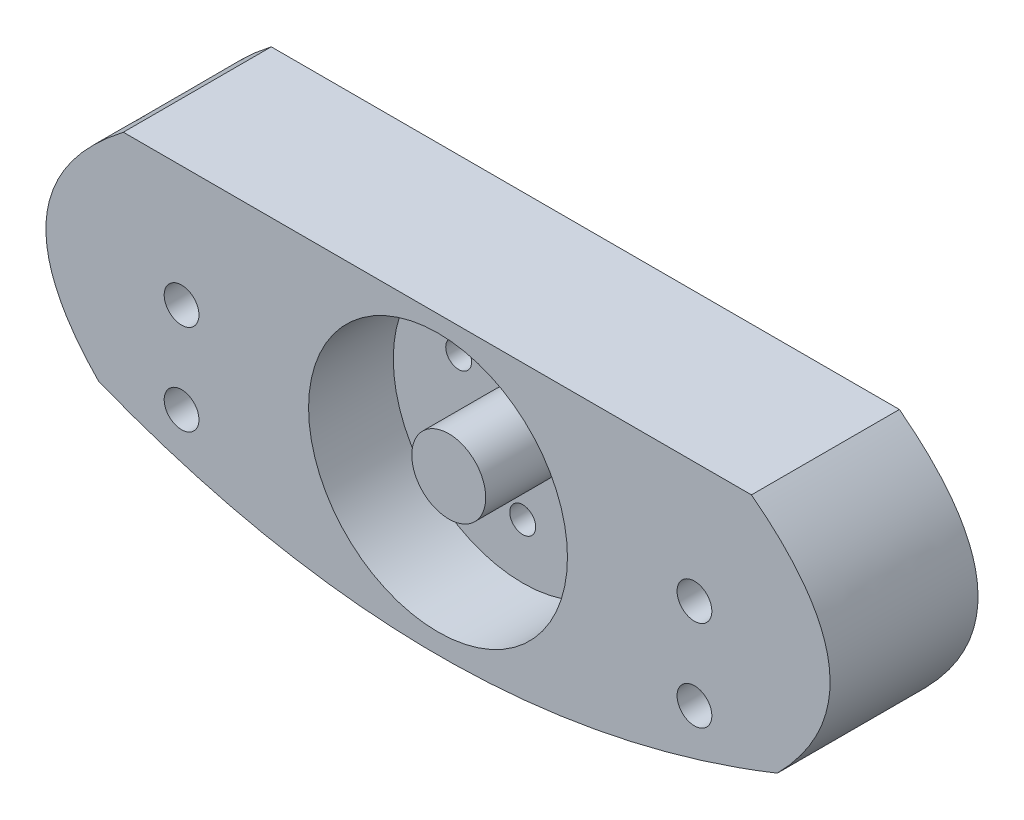
ISO-10303-21;
HEADER;
FILE_DESCRIPTION(('STEP AP214'),'2;1');
FILE_NAME('part.step','',(''),(''),'','','');
FILE_SCHEMA(('AUTOMOTIVE_DESIGN { 1 0 10303 214 1 1 1 1 }'));
ENDSEC;
DATA;
#1=APPLICATION_CONTEXT('core data for automotive mechanical design processes');
#2=APPLICATION_PROTOCOL_DEFINITION('international standard','automotive_design',2000,#1);
#3=PRODUCT_CONTEXT('',#1,'mechanical');
#4=PRODUCT('Part','Part','',(#3));
#5=PRODUCT_RELATED_PRODUCT_CATEGORY('part','',(#4));
#6=PRODUCT_DEFINITION_FORMATION('','',#4);
#7=PRODUCT_DEFINITION_CONTEXT('part definition',#1,'design');
#8=PRODUCT_DEFINITION('design','',#6,#7);
#9=PRODUCT_DEFINITION_SHAPE('','',#8);
#10=(LENGTH_UNIT() NAMED_UNIT(*) SI_UNIT(.MILLI.,.METRE.));
#11=(NAMED_UNIT(*) PLANE_ANGLE_UNIT() SI_UNIT($,.RADIAN.));
#12=(NAMED_UNIT(*) SI_UNIT($,.STERADIAN.) SOLID_ANGLE_UNIT());
#13=UNCERTAINTY_MEASURE_WITH_UNIT(LENGTH_MEASURE(1.E-05),#10,'distance_accuracy_value','');
#14=(GEOMETRIC_REPRESENTATION_CONTEXT(3) GLOBAL_UNCERTAINTY_ASSIGNED_CONTEXT((#13)) GLOBAL_UNIT_ASSIGNED_CONTEXT((#10,
#11,#12)) REPRESENTATION_CONTEXT('',''));
#15=CARTESIAN_POINT('',(0.,0.,0.));
#16=DIRECTION('',(0.,0.,1.));
#17=DIRECTION('',(1.,0.,0.));
#18=AXIS2_PLACEMENT_3D('',#15,#16,#17);
#19=CARTESIAN_POINT('',(-26324.5669752952,999737.504268862,20.));
#20=CARTESIAN_POINT('',(11140.8528513191,-999969.224310154,20.));
#21=CARTESIAN_POINT('',(4048.40687662535,1000075.86398588,20.));
#22=B_SPLINE_CURVE_WITH_KNOTS('',2,(#19,#20,#21),.UNSPECIFIED.,.F.,.F.,(3,3),(0.,1.),.UNSPECIFIED.);
#23=DIRECTION('',(0.,0.,-1.));
#24=VECTOR('',#23,1.);
#25=SURFACE_OF_LINEAR_EXTRUSION('',#22,#24);
#26=CARTESIAN_POINT('',(-26324.5669752952,999737.504268862,0.));
#27=CARTESIAN_POINT('',(11140.8528513191,-999969.224310154,0.));
#28=CARTESIAN_POINT('',(4048.40687662535,1000075.86398588,0.));
#29=B_SPLINE_CURVE_WITH_KNOTS('',2,(#26,#27,#28),.UNSPECIFIED.,.F.,.F.,(3,3),(0.,1.),.UNSPECIFIED.);
#30=CARTESIAN_POINT('',(-45.8736983758243,-22.1554979709055,0.));
#31=VERTEX_POINT('',#30);
#32=CARTESIAN_POINT('',(45.8736984182559,-22.1554979278173,0.));
#33=VERTEX_POINT('',#32);
#34=EDGE_CURVE('E108',#31,#33,#29,.T.);
#35=ORIENTED_EDGE('',*,*,#34,.T.);
#36=DIRECTION('',(0.,0.,-1.));
#37=VECTOR('',#36,1.);
#38=CARTESIAN_POINT('',(45.8736984182559,-22.1554979278173,20.));
#39=LINE('',#38,#37);
#40=CARTESIAN_POINT('',(45.8736984182559,-22.1554979278173,20.));
#41=VERTEX_POINT('',#40);
#42=EDGE_CURVE('E11',#41,#33,#39,.T.);
#43=ORIENTED_EDGE('',*,*,#42,.F.);
#44=CARTESIAN_POINT('',(-45.8736983758243,-22.1554979709055,20.));
#45=VERTEX_POINT('',#44);
#46=EDGE_CURVE('E90',#45,#41,#22,.T.);
#47=ORIENTED_EDGE('',*,*,#46,.F.);
#48=DIRECTION('',(0.,0.,-1.));
#49=VECTOR('',#48,1.);
#50=CARTESIAN_POINT('',(-45.8736983758243,-22.1554979709055,20.));
#51=LINE('',#50,#49);
#52=EDGE_CURVE('E99',#45,#31,#51,.T.);
#53=ORIENTED_EDGE('',*,*,#52,.T.);
#54=EDGE_LOOP('',(#35,#43,#47,#53));
#55=FACE_BOUND('',#54,.T.);
#56=ADVANCED_FACE('F36',(#55),#25,.F.);
#57=CARTESIAN_POINT('',(-998869.892599196,-46700.884225398,20.));
#58=CARTESIAN_POINT('',(999192.30166922,41473.3119298266,20.));
#59=CARTESIAN_POINT('',(-999302.733099754,-36275.1095081386,20.));
#60=B_SPLINE_CURVE_WITH_KNOTS('',2,(#57,#58,#59),.UNSPECIFIED.,.F.,.F.,(3,3),(0.,1.),.UNSPECIFIED.);
#61=DIRECTION('',(0.,0.,-1.));
#62=VECTOR('',#61,1.);
#63=SURFACE_OF_LINEAR_EXTRUSION('',#60,#62);
#64=CARTESIAN_POINT('',(-998869.892599196,-46700.884225398,0.));
#65=CARTESIAN_POINT('',(999192.30166922,41473.3119298266,0.));
#66=CARTESIAN_POINT('',(-999302.733099754,-36275.1095081386,0.));
#67=B_SPLINE_CURVE_WITH_KNOTS('',2,(#64,#65,#66),.UNSPECIFIED.,.F.,.F.,(3,3),(0.,1.),.UNSPECIFIED.);
#68=CARTESIAN_POINT('',(42.3767761233695,8.68321874866895,0.));
#69=VERTEX_POINT('',#68);
#70=EDGE_CURVE('E94',#33,#69,#67,.T.);
#71=ORIENTED_EDGE('',*,*,#70,.T.);
#72=DIRECTION('',(0.,0.,-1.));
#73=VECTOR('',#72,1.);
#74=CARTESIAN_POINT('',(42.3767761233695,8.68321874866895,20.));
#75=LINE('',#74,#73);
#76=CARTESIAN_POINT('',(42.3767761233695,8.68321874866895,20.));
#77=VERTEX_POINT('',#76);
#78=EDGE_CURVE('E46',#77,#69,#75,.T.);
#79=ORIENTED_EDGE('',*,*,#78,.F.);
#80=EDGE_CURVE('E85',#41,#77,#60,.T.);
#81=ORIENTED_EDGE('',*,*,#80,.F.);
#82=ORIENTED_EDGE('',*,*,#42,.T.);
#83=EDGE_LOOP('',(#71,#79,#81,#82));
#84=FACE_BOUND('',#83,.T.);
#85=ADVANCED_FACE('F93',(#84),#63,.F.);
#86=CARTESIAN_POINT('',(42.3767761245835,8.68321874768441,20.));
#87=DIRECTION('',(1.15423428498959E-11,-1.,0.));
#88=DIRECTION('',(1.,1.15423428498959E-11,0.));
#89=AXIS2_PLACEMENT_3D('',#86,#87,#88);
#90=PLANE('',#89);
#91=DIRECTION('',(-1.,-1.15423428498959E-11,0.));
#92=VECTOR('',#91,1.);
#93=CARTESIAN_POINT('',(42.3767761245835,8.68321874768441,0.));
#94=LINE('',#93,#92);
#95=CARTESIAN_POINT('',(-42.5400898319191,8.68321874670427,0.));
#96=VERTEX_POINT('',#95);
#97=EDGE_CURVE('E72',#69,#96,#94,.T.);
#98=ORIENTED_EDGE('',*,*,#97,.T.);
#99=DIRECTION('',(0.,0.,-1.));
#100=VECTOR('',#99,1.);
#101=CARTESIAN_POINT('',(-42.5400898319191,8.68321874670427,20.));
#102=LINE('',#101,#100);
#103=CARTESIAN_POINT('',(-42.5400898319191,8.68321874670427,20.));
#104=VERTEX_POINT('',#103);
#105=EDGE_CURVE('E95',#104,#96,#102,.T.);
#106=ORIENTED_EDGE('',*,*,#105,.F.);
#107=DIRECTION('',(-1.,-1.15423428498959E-11,0.));
#108=VECTOR('',#107,1.);
#109=CARTESIAN_POINT('',(42.3767761245835,8.68321874768441,20.));
#110=LINE('',#109,#108);
#111=EDGE_CURVE('E88',#77,#104,#110,.T.);
#112=ORIENTED_EDGE('',*,*,#111,.F.);
#113=ORIENTED_EDGE('',*,*,#78,.T.);
#114=EDGE_LOOP('',(#98,#106,#112,#113));
#115=FACE_BOUND('',#114,.T.);
#116=ADVANCED_FACE('F97',(#115),#90,.F.);
#117=CARTESIAN_POINT('',(999423.299806603,-32787.8694532893,20.));
#118=CARTESIAN_POINT('',(-999330.20137227,38006.7010376896,20.));
#119=CARTESIAN_POINT('',(999025.115011576,-43254.9699162479,20.));
#120=B_SPLINE_CURVE_WITH_KNOTS('',2,(#117,#118,#119),.UNSPECIFIED.,.F.,.F.,(3,3),(0.,1.),.UNSPECIFIED.);
#121=DIRECTION('',(0.,0.,-1.));
#122=VECTOR('',#121,1.);
#123=SURFACE_OF_LINEAR_EXTRUSION('',#120,#122);
#124=CARTESIAN_POINT('',(999423.299806603,-32787.8694532893,0.));
#125=CARTESIAN_POINT('',(-999330.20137227,38006.7010376896,0.));
#126=CARTESIAN_POINT('',(999025.115011576,-43254.9699162479,0.));
#127=B_SPLINE_CURVE_WITH_KNOTS('',2,(#124,#125,#126),.UNSPECIFIED.,.F.,.F.,(3,3),(0.,1.),.UNSPECIFIED.);
#128=EDGE_CURVE('E78',#96,#31,#127,.T.);
#129=ORIENTED_EDGE('',*,*,#128,.T.);
#130=ORIENTED_EDGE('',*,*,#52,.F.);
#131=EDGE_CURVE('E55',#104,#45,#120,.T.);
#132=ORIENTED_EDGE('',*,*,#131,.F.);
#133=ORIENTED_EDGE('',*,*,#105,.T.);
#134=EDGE_LOOP('',(#129,#130,#132,#133));
#135=FACE_BOUND('',#134,.T.);
#136=ADVANCED_FACE('F116',(#135),#123,.F.);
#137=CARTESIAN_POINT('',(1.38640099212139,-31.2700913924573,20.));
#138=DIRECTION('',(0.,0.,-1.));
#139=DIRECTION('',(-1.,0.,0.));
#140=AXIS2_PLACEMENT_3D('',#137,#138,#139);
#141=PLANE('',#140);
#142=CARTESIAN_POINT('',(34.6697785374181,-19.8651886519201,20.));
#143=DIRECTION('',(0.,0.,-1.));
#144=DIRECTION('',(-1.,0.,0.));
#145=AXIS2_PLACEMENT_3D('',#142,#143,#144);
#146=CIRCLE('',#145,2.35);
#147=CARTESIAN_POINT('',(32.3197785374181,-19.8651886519201,20.));
#148=VERTEX_POINT('',#147);
#149=EDGE_CURVE('E220',#148,#148,#146,.T.);
#150=ORIENTED_EDGE('',*,*,#149,.T.);
#151=EDGE_LOOP('',(#150));
#152=FACE_BOUND('',#151,.T.);
#153=CARTESIAN_POINT('',(34.6697785374181,-7.61694864824988,20.));
#154=DIRECTION('',(0.,0.,-1.));
#155=DIRECTION('',(-1.,0.,0.));
#156=AXIS2_PLACEMENT_3D('',#153,#154,#155);
#157=CIRCLE('',#156,2.35);
#158=CARTESIAN_POINT('',(32.3197785374181,-7.61694864824988,20.));
#159=VERTEX_POINT('',#158);
#160=EDGE_CURVE('E224',#159,#159,#157,.T.);
#161=ORIENTED_EDGE('',*,*,#160,.T.);
#162=EDGE_LOOP('',(#161));
#163=FACE_BOUND('',#162,.T.);
#164=CARTESIAN_POINT('',(-34.6697785374181,-7.61694864824988,20.));
#165=DIRECTION('',(0.,0.,-1.));
#166=DIRECTION('',(-1.,0.,0.));
#167=AXIS2_PLACEMENT_3D('',#164,#165,#166);
#168=CIRCLE('',#167,2.35);
#169=CARTESIAN_POINT('',(-37.0197785374181,-7.61694864824988,20.));
#170=VERTEX_POINT('',#169);
#171=EDGE_CURVE('E228',#170,#170,#168,.T.);
#172=ORIENTED_EDGE('',*,*,#171,.T.);
#173=EDGE_LOOP('',(#172));
#174=FACE_BOUND('',#173,.T.);
#175=CARTESIAN_POINT('',(-34.6697785374181,-19.8651886519201,20.));
#176=DIRECTION('',(0.,0.,-1.));
#177=DIRECTION('',(-1.,0.,0.));
#178=AXIS2_PLACEMENT_3D('',#175,#176,#177);
#179=CIRCLE('',#178,2.35);
#180=CARTESIAN_POINT('',(-37.0197785374181,-19.8651886519201,20.));
#181=VERTEX_POINT('',#180);
#182=EDGE_CURVE('E232',#181,#181,#179,.T.);
#183=ORIENTED_EDGE('',*,*,#182,.T.);
#184=EDGE_LOOP('',(#183));
#185=FACE_BOUND('',#184,.T.);
#186=CARTESIAN_POINT('',(0.,-11.0630249070138,20.));
#187=DIRECTION('',(0.,0.,1.));
#188=DIRECTION('',(1.,0.,0.));
#189=AXIS2_PLACEMENT_3D('',#186,#187,#188);
#190=CIRCLE('',#189,17.5);
#191=CARTESIAN_POINT('',(17.5,-11.0630249070138,20.));
#192=VERTEX_POINT('',#191);
#193=EDGE_CURVE('E135',#192,#192,#190,.T.);
#194=ORIENTED_EDGE('',*,*,#193,.F.);
#195=EDGE_LOOP('',(#194));
#196=FACE_BOUND('',#195,.T.);
#197=ORIENTED_EDGE('',*,*,#46,.T.);
#198=ORIENTED_EDGE('',*,*,#80,.T.);
#199=ORIENTED_EDGE('',*,*,#111,.T.);
#200=ORIENTED_EDGE('',*,*,#131,.T.);
#201=EDGE_LOOP('',(#197,#198,#199,#200));
#202=FACE_BOUND('',#201,.T.);
#203=ADVANCED_FACE('F86',(#152,#163,#174,#185,#196,#202),#141,.F.);
#204=CARTESIAN_POINT('',(1.38640099212139,-31.2700913924573,0.));
#205=DIRECTION('',(0.,0.,-1.));
#206=DIRECTION('',(-1.,0.,0.));
#207=AXIS2_PLACEMENT_3D('',#204,#205,#206);
#208=PLANE('',#207);
#209=CARTESIAN_POINT('',(34.6697785374181,-19.8651886519201,0.));
#210=DIRECTION('',(0.,0.,1.));
#211=DIRECTION('',(1.,0.,0.));
#212=AXIS2_PLACEMENT_3D('',#209,#210,#211);
#213=CIRCLE('',#212,2.35);
#214=CARTESIAN_POINT('',(37.0197785374181,-19.8651886519201,0.));
#215=VERTEX_POINT('',#214);
#216=EDGE_CURVE('E501',#215,#215,#213,.T.);
#217=ORIENTED_EDGE('',*,*,#216,.T.);
#218=EDGE_LOOP('',(#217));
#219=FACE_BOUND('',#218,.T.);
#220=CARTESIAN_POINT('',(34.6697785374181,-7.61694864824988,0.));
#221=DIRECTION('',(0.,0.,1.));
#222=DIRECTION('',(1.,0.,0.));
#223=AXIS2_PLACEMENT_3D('',#220,#221,#222);
#224=CIRCLE('',#223,2.35);
#225=CARTESIAN_POINT('',(37.0197785374181,-7.61694864824988,0.));
#226=VERTEX_POINT('',#225);
#227=EDGE_CURVE('E502',#226,#226,#224,.T.);
#228=ORIENTED_EDGE('',*,*,#227,.T.);
#229=EDGE_LOOP('',(#228));
#230=FACE_BOUND('',#229,.T.);
#231=CARTESIAN_POINT('',(-34.6697785374181,-7.61694864824988,0.));
#232=DIRECTION('',(0.,0.,1.));
#233=DIRECTION('',(1.,0.,0.));
#234=AXIS2_PLACEMENT_3D('',#231,#232,#233);
#235=CIRCLE('',#234,2.35);
#236=CARTESIAN_POINT('',(-32.3197785374181,-7.61694864824988,0.));
#237=VERTEX_POINT('',#236);
#238=EDGE_CURVE('E240',#237,#237,#235,.T.);
#239=ORIENTED_EDGE('',*,*,#238,.T.);
#240=EDGE_LOOP('',(#239));
#241=FACE_BOUND('',#240,.T.);
#242=CARTESIAN_POINT('',(-34.6697785374181,-19.8651886519201,0.));
#243=DIRECTION('',(0.,0.,1.));
#244=DIRECTION('',(1.,0.,0.));
#245=AXIS2_PLACEMENT_3D('',#242,#243,#244);
#246=CIRCLE('',#245,2.35);
#247=CARTESIAN_POINT('',(-32.3197785374181,-19.8651886519201,0.));
#248=VERTEX_POINT('',#247);
#249=EDGE_CURVE('E236',#248,#248,#246,.T.);
#250=ORIENTED_EDGE('',*,*,#249,.T.);
#251=EDGE_LOOP('',(#250));
#252=FACE_BOUND('',#251,.T.);
#253=CARTESIAN_POINT('',(8.66025403784439,-6.12947958638999,0.));
#254=DIRECTION('',(0.,0.,-1.));
#255=DIRECTION('',(-1.,0.,0.));
#256=AXIS2_PLACEMENT_3D('',#253,#254,#255);
#257=CIRCLE('',#256,3.5);
#258=CARTESIAN_POINT('',(5.16025403784439,-6.12947958638999,0.));
#259=VERTEX_POINT('',#258);
#260=EDGE_CURVE('E246',#259,#259,#257,.T.);
#261=ORIENTED_EDGE('',*,*,#260,.F.);
#262=EDGE_LOOP('',(#261));
#263=FACE_BOUND('',#262,.T.);
#264=CARTESIAN_POINT('',(0.,-21.12947958639,0.));
#265=DIRECTION('',(0.,0.,-1.));
#266=DIRECTION('',(-1.,0.,0.));
#267=AXIS2_PLACEMENT_3D('',#264,#265,#266);
#268=CIRCLE('',#267,3.5);
#269=CARTESIAN_POINT('',(-3.5,-21.12947958639,0.));
#270=VERTEX_POINT('',#269);
#271=EDGE_CURVE('E179',#270,#270,#268,.T.);
#272=ORIENTED_EDGE('',*,*,#271,.F.);
#273=EDGE_LOOP('',(#272));
#274=FACE_BOUND('',#273,.T.);
#275=CARTESIAN_POINT('',(-8.66025403784439,-6.12947958638999,0.));
#276=DIRECTION('',(0.,0.,-1.));
#277=DIRECTION('',(-1.,0.,0.));
#278=AXIS2_PLACEMENT_3D('',#275,#276,#277);
#279=CIRCLE('',#278,3.5);
#280=CARTESIAN_POINT('',(-12.1602540378444,-6.12947958638999,0.));
#281=VERTEX_POINT('',#280);
#282=EDGE_CURVE('E166',#281,#281,#279,.T.);
#283=ORIENTED_EDGE('',*,*,#282,.F.);
#284=EDGE_LOOP('',(#283));
#285=FACE_BOUND('',#284,.T.);
#286=ORIENTED_EDGE('',*,*,#34,.F.);
#287=ORIENTED_EDGE('',*,*,#128,.F.);
#288=ORIENTED_EDGE('',*,*,#97,.F.);
#289=ORIENTED_EDGE('',*,*,#70,.F.);
#290=EDGE_LOOP('',(#286,#287,#288,#289));
#291=FACE_BOUND('',#290,.T.);
#292=ADVANCED_FACE('F120',(#219,#230,#241,#252,#263,#274,#285,#291),#208,.T.);
#293=CARTESIAN_POINT('',(0.,-11.0630249070138,8.54674907405911));
#294=DIRECTION('',(0.,0.,1.));
#295=DIRECTION('',(1.,0.,0.));
#296=AXIS2_PLACEMENT_3D('',#293,#294,#295);
#297=CYLINDRICAL_SURFACE('',#296,17.5);
#298=CARTESIAN_POINT('',(0.,-11.0630249070138,8.54674907405911));
#299=DIRECTION('',(0.,0.,1.));
#300=DIRECTION('',(1.,0.,0.));
#301=AXIS2_PLACEMENT_3D('',#298,#299,#300);
#302=CIRCLE('',#301,17.5);
#303=CARTESIAN_POINT('',(17.5,-11.0630249070138,8.54674907405911));
#304=VERTEX_POINT('',#303);
#305=EDGE_CURVE('E133',#304,#304,#302,.T.);
#306=ORIENTED_EDGE('',*,*,#305,.F.);
#307=EDGE_LOOP('',(#306));
#308=FACE_BOUND('',#307,.T.);
#309=ORIENTED_EDGE('',*,*,#193,.T.);
#310=EDGE_LOOP('',(#309));
#311=FACE_BOUND('',#310,.T.);
#312=ADVANCED_FACE('F196',(#308,#311),#297,.F.);
#313=CARTESIAN_POINT('',(0.,-11.0630249070138,8.54674907405911));
#314=DIRECTION('',(0.,0.,1.));
#315=DIRECTION('',(1.,0.,0.));
#316=AXIS2_PLACEMENT_3D('',#313,#314,#315);
#317=PLANE('',#316);
#318=CARTESIAN_POINT('',(8.66025403784439,-6.12947958638999,8.54674907405911));
#319=DIRECTION('',(0.,0.,1.));
#320=DIRECTION('',(1.,0.,0.));
#321=AXIS2_PLACEMENT_3D('',#318,#319,#320);
#322=CIRCLE('',#321,1.75);
#323=CARTESIAN_POINT('',(10.4102540378444,-6.12947958638999,8.54674907405911));
#324=VERTEX_POINT('',#323);
#325=EDGE_CURVE('E40',#324,#324,#322,.T.);
#326=ORIENTED_EDGE('',*,*,#325,.F.);
#327=EDGE_LOOP('',(#326));
#328=FACE_BOUND('',#327,.T.);
#329=CARTESIAN_POINT('',(0.,-21.12947958639,8.54674907405911));
#330=DIRECTION('',(0.,0.,1.));
#331=DIRECTION('',(1.,0.,0.));
#332=AXIS2_PLACEMENT_3D('',#329,#330,#331);
#333=CIRCLE('',#332,1.75);
#334=CARTESIAN_POINT('',(1.75,-21.12947958639,8.54674907405911));
#335=VERTEX_POINT('',#334);
#336=EDGE_CURVE('E164',#335,#335,#333,.T.);
#337=ORIENTED_EDGE('',*,*,#336,.F.);
#338=EDGE_LOOP('',(#337));
#339=FACE_BOUND('',#338,.T.);
#340=CARTESIAN_POINT('',(-8.66025403784439,-6.12947958638999,8.54674907405911));
#341=DIRECTION('',(0.,0.,1.));
#342=DIRECTION('',(1.,0.,0.));
#343=AXIS2_PLACEMENT_3D('',#340,#341,#342);
#344=CIRCLE('',#343,1.75);
#345=CARTESIAN_POINT('',(-6.91025403784439,-6.12947958638999,8.54674907405911));
#346=VERTEX_POINT('',#345);
#347=EDGE_CURVE('E161',#346,#346,#344,.T.);
#348=ORIENTED_EDGE('',*,*,#347,.F.);
#349=EDGE_LOOP('',(#348));
#350=FACE_BOUND('',#349,.T.);
#351=CARTESIAN_POINT('',(0.,-11.0630249070138,8.54674907405911));
#352=DIRECTION('',(0.,0.,1.));
#353=DIRECTION('',(1.,0.,0.));
#354=AXIS2_PLACEMENT_3D('',#351,#352,#353);
#355=CIRCLE('',#354,5.);
#356=CARTESIAN_POINT('',(5.,-11.0630249070138,8.54674907405911));
#357=VERTEX_POINT('',#356);
#358=EDGE_CURVE('E143',#357,#357,#355,.T.);
#359=ORIENTED_EDGE('',*,*,#358,.F.);
#360=EDGE_LOOP('',(#359));
#361=FACE_BOUND('',#360,.T.);
#362=ORIENTED_EDGE('',*,*,#305,.T.);
#363=EDGE_LOOP('',(#362));
#364=FACE_BOUND('',#363,.T.);
#365=ADVANCED_FACE('F194',(#328,#339,#350,#361,#364),#317,.T.);
#366=CARTESIAN_POINT('',(0.,-11.0630249070138,18.5467490740591));
#367=DIRECTION('',(0.,0.,-1.));
#368=DIRECTION('',(-1.,0.,0.));
#369=AXIS2_PLACEMENT_3D('',#366,#367,#368);
#370=CYLINDRICAL_SURFACE('',#369,5.);
#371=CARTESIAN_POINT('',(0.,-11.0630249070138,18.5467490740591));
#372=DIRECTION('',(0.,0.,1.));
#373=DIRECTION('',(1.,0.,0.));
#374=AXIS2_PLACEMENT_3D('',#371,#372,#373);
#375=CIRCLE('',#374,5.);
#376=CARTESIAN_POINT('',(5.,-11.0630249070138,18.5467490740591));
#377=VERTEX_POINT('',#376);
#378=EDGE_CURVE('E140',#377,#377,#375,.T.);
#379=ORIENTED_EDGE('',*,*,#378,.F.);
#380=EDGE_LOOP('',(#379));
#381=FACE_BOUND('',#380,.T.);
#382=ORIENTED_EDGE('',*,*,#358,.T.);
#383=EDGE_LOOP('',(#382));
#384=FACE_BOUND('',#383,.T.);
#385=ADVANCED_FACE('F192',(#381,#384),#370,.T.);
#386=CARTESIAN_POINT('',(0.,-11.0630249070138,18.5467490740591));
#387=DIRECTION('',(0.,0.,1.));
#388=DIRECTION('',(1.,0.,0.));
#389=AXIS2_PLACEMENT_3D('',#386,#387,#388);
#390=PLANE('',#389);
#391=ORIENTED_EDGE('',*,*,#378,.T.);
#392=EDGE_LOOP('',(#391));
#393=FACE_BOUND('',#392,.T.);
#394=ADVANCED_FACE('F203',(#393),#390,.T.);
#395=CARTESIAN_POINT('',(-8.66025403784439,-6.12947958638999,0.));
#396=DIRECTION('',(0.,0.,-1.));
#397=DIRECTION('',(-1.,0.,0.));
#398=AXIS2_PLACEMENT_3D('',#395,#396,#397);
#399=CYLINDRICAL_SURFACE('',#398,1.75);
#400=ORIENTED_EDGE('',*,*,#347,.T.);
#401=EDGE_LOOP('',(#400));
#402=FACE_BOUND('',#401,.T.);
#403=CARTESIAN_POINT('',(-8.66025403784439,-6.12947958638999,4.));
#404=DIRECTION('',(0.,0.,-1.));
#405=DIRECTION('',(-1.,0.,0.));
#406=AXIS2_PLACEMENT_3D('',#403,#404,#405);
#407=CIRCLE('',#406,1.75);
#408=CARTESIAN_POINT('',(-10.4102540378444,-6.12947958638999,4.));
#409=VERTEX_POINT('',#408);
#410=EDGE_CURVE('E163',#409,#409,#407,.T.);
#411=ORIENTED_EDGE('',*,*,#410,.T.);
#412=EDGE_LOOP('',(#411));
#413=FACE_BOUND('',#412,.T.);
#414=ADVANCED_FACE('F295',(#402,#413),#399,.F.);
#415=CARTESIAN_POINT('',(-6.91025403784439,-6.12947958638999,4.));
#416=DIRECTION('',(0.,0.,1.));
#417=DIRECTION('',(1.,0.,0.));
#418=AXIS2_PLACEMENT_3D('',#415,#416,#417);
#419=PLANE('',#418);
#420=ORIENTED_EDGE('',*,*,#410,.F.);
#421=EDGE_LOOP('',(#420));
#422=FACE_BOUND('',#421,.T.);
#423=CARTESIAN_POINT('',(-8.66025403784439,-6.12947958638999,4.));
#424=DIRECTION('',(0.,0.,-1.));
#425=DIRECTION('',(-1.,0.,0.));
#426=AXIS2_PLACEMENT_3D('',#423,#424,#425);
#427=CIRCLE('',#426,3.5);
#428=CARTESIAN_POINT('',(-12.1602540378444,-6.12947958638999,4.));
#429=VERTEX_POINT('',#428);
#430=EDGE_CURVE('E171',#429,#429,#427,.T.);
#431=ORIENTED_EDGE('',*,*,#430,.T.);
#432=EDGE_LOOP('',(#431));
#433=FACE_BOUND('',#432,.T.);
#434=ADVANCED_FACE('F286',(#422,#433),#419,.F.);
#435=CARTESIAN_POINT('',(-8.66025403784439,-6.12947958638999,0.));
#436=DIRECTION('',(0.,0.,-1.));
#437=DIRECTION('',(-1.,0.,0.));
#438=AXIS2_PLACEMENT_3D('',#435,#436,#437);
#439=CYLINDRICAL_SURFACE('',#438,3.5);
#440=ORIENTED_EDGE('',*,*,#430,.F.);
#441=EDGE_LOOP('',(#440));
#442=FACE_BOUND('',#441,.T.);
#443=ORIENTED_EDGE('',*,*,#282,.T.);
#444=EDGE_LOOP('',(#443));
#445=FACE_BOUND('',#444,.T.);
#446=ADVANCED_FACE('F283',(#442,#445),#439,.F.);
#447=CARTESIAN_POINT('',(0.,-21.12947958639,0.));
#448=DIRECTION('',(0.,0.,-1.));
#449=DIRECTION('',(-1.,0.,0.));
#450=AXIS2_PLACEMENT_3D('',#447,#448,#449);
#451=CYLINDRICAL_SURFACE('',#450,1.75);
#452=ORIENTED_EDGE('',*,*,#336,.T.);
#453=EDGE_LOOP('',(#452));
#454=FACE_BOUND('',#453,.T.);
#455=CARTESIAN_POINT('',(0.,-21.12947958639,4.));
#456=DIRECTION('',(0.,0.,-1.));
#457=DIRECTION('',(-1.,0.,0.));
#458=AXIS2_PLACEMENT_3D('',#455,#456,#457);
#459=CIRCLE('',#458,1.75);
#460=CARTESIAN_POINT('',(-1.75,-21.12947958639,4.));
#461=VERTEX_POINT('',#460);
#462=EDGE_CURVE('E167',#461,#461,#459,.T.);
#463=ORIENTED_EDGE('',*,*,#462,.T.);
#464=EDGE_LOOP('',(#463));
#465=FACE_BOUND('',#464,.T.);
#466=ADVANCED_FACE('F285',(#454,#465),#451,.F.);
#467=CARTESIAN_POINT('',(1.75,-21.12947958639,4.));
#468=DIRECTION('',(0.,0.,1.));
#469=DIRECTION('',(1.,0.,0.));
#470=AXIS2_PLACEMENT_3D('',#467,#468,#469);
#471=PLANE('',#470);
#472=ORIENTED_EDGE('',*,*,#462,.F.);
#473=EDGE_LOOP('',(#472));
#474=FACE_BOUND('',#473,.T.);
#475=CARTESIAN_POINT('',(0.,-21.12947958639,4.));
#476=DIRECTION('',(0.,0.,-1.));
#477=DIRECTION('',(-1.,0.,0.));
#478=AXIS2_PLACEMENT_3D('',#475,#476,#477);
#479=CIRCLE('',#478,3.5);
#480=CARTESIAN_POINT('',(-3.5,-21.12947958639,4.));
#481=VERTEX_POINT('',#480);
#482=EDGE_CURVE('E174',#481,#481,#479,.T.);
#483=ORIENTED_EDGE('',*,*,#482,.T.);
#484=EDGE_LOOP('',(#483));
#485=FACE_BOUND('',#484,.T.);
#486=ADVANCED_FACE('F293',(#474,#485),#471,.F.);
#487=CARTESIAN_POINT('',(0.,-21.12947958639,0.));
#488=DIRECTION('',(0.,0.,-1.));
#489=DIRECTION('',(-1.,0.,0.));
#490=AXIS2_PLACEMENT_3D('',#487,#488,#489);
#491=CYLINDRICAL_SURFACE('',#490,3.5);
#492=ORIENTED_EDGE('',*,*,#482,.F.);
#493=EDGE_LOOP('',(#492));
#494=FACE_BOUND('',#493,.T.);
#495=ORIENTED_EDGE('',*,*,#271,.T.);
#496=EDGE_LOOP('',(#495));
#497=FACE_BOUND('',#496,.T.);
#498=ADVANCED_FACE('F263',(#494,#497),#491,.F.);
#499=CARTESIAN_POINT('',(8.66025403784439,-6.12947958638999,0.));
#500=DIRECTION('',(0.,0.,-1.));
#501=DIRECTION('',(-1.,0.,0.));
#502=AXIS2_PLACEMENT_3D('',#499,#500,#501);
#503=CYLINDRICAL_SURFACE('',#502,1.75);
#504=ORIENTED_EDGE('',*,*,#325,.T.);
#505=EDGE_LOOP('',(#504));
#506=FACE_BOUND('',#505,.T.);
#507=CARTESIAN_POINT('',(8.66025403784439,-6.12947958638999,4.));
#508=DIRECTION('',(0.,0.,-1.));
#509=DIRECTION('',(-1.,0.,0.));
#510=AXIS2_PLACEMENT_3D('',#507,#508,#509);
#511=CIRCLE('',#510,1.75);
#512=CARTESIAN_POINT('',(6.91025403784439,-6.12947958638999,4.));
#513=VERTEX_POINT('',#512);
#514=EDGE_CURVE('E252',#513,#513,#511,.T.);
#515=ORIENTED_EDGE('',*,*,#514,.T.);
#516=EDGE_LOOP('',(#515));
#517=FACE_BOUND('',#516,.T.);
#518=ADVANCED_FACE('F259',(#506,#517),#503,.F.);
#519=CARTESIAN_POINT('',(10.4102540378444,-6.12947958638999,4.));
#520=DIRECTION('',(0.,0.,1.));
#521=DIRECTION('',(1.,0.,0.));
#522=AXIS2_PLACEMENT_3D('',#519,#520,#521);
#523=PLANE('',#522);
#524=ORIENTED_EDGE('',*,*,#514,.F.);
#525=EDGE_LOOP('',(#524));
#526=FACE_BOUND('',#525,.T.);
#527=CARTESIAN_POINT('',(8.66025403784439,-6.12947958638999,4.));
#528=DIRECTION('',(0.,0.,-1.));
#529=DIRECTION('',(-1.,0.,0.));
#530=AXIS2_PLACEMENT_3D('',#527,#528,#529);
#531=CIRCLE('',#530,3.5);
#532=CARTESIAN_POINT('',(5.16025403784439,-6.12947958638999,4.));
#533=VERTEX_POINT('',#532);
#534=EDGE_CURVE('E249',#533,#533,#531,.T.);
#535=ORIENTED_EDGE('',*,*,#534,.T.);
#536=EDGE_LOOP('',(#535));
#537=FACE_BOUND('',#536,.T.);
#538=ADVANCED_FACE('F262',(#526,#537),#523,.F.);
#539=CARTESIAN_POINT('',(8.66025403784439,-6.12947958638999,0.));
#540=DIRECTION('',(0.,0.,-1.));
#541=DIRECTION('',(-1.,0.,0.));
#542=AXIS2_PLACEMENT_3D('',#539,#540,#541);
#543=CYLINDRICAL_SURFACE('',#542,3.5);
#544=ORIENTED_EDGE('',*,*,#534,.F.);
#545=EDGE_LOOP('',(#544));
#546=FACE_BOUND('',#545,.T.);
#547=ORIENTED_EDGE('',*,*,#260,.T.);
#548=EDGE_LOOP('',(#547));
#549=FACE_BOUND('',#548,.T.);
#550=ADVANCED_FACE('F269',(#546,#549),#543,.F.);
#551=CARTESIAN_POINT('',(-34.6697785374181,-19.8651886519201,0.));
#552=DIRECTION('',(0.,0.,1.));
#553=DIRECTION('',(1.,0.,0.));
#554=AXIS2_PLACEMENT_3D('',#551,#552,#553);
#555=CYLINDRICAL_SURFACE('',#554,2.35);
#556=ORIENTED_EDGE('',*,*,#249,.F.);
#557=EDGE_LOOP('',(#556));
#558=FACE_BOUND('',#557,.T.);
#559=ORIENTED_EDGE('',*,*,#182,.F.);
#560=EDGE_LOOP('',(#559));
#561=FACE_BOUND('',#560,.T.);
#562=ADVANCED_FACE('F275',(#558,#561),#555,.F.);
#563=CARTESIAN_POINT('',(-34.6697785374181,-7.61694864824988,0.));
#564=DIRECTION('',(0.,0.,1.));
#565=DIRECTION('',(1.,0.,0.));
#566=AXIS2_PLACEMENT_3D('',#563,#564,#565);
#567=CYLINDRICAL_SURFACE('',#566,2.35);
#568=ORIENTED_EDGE('',*,*,#238,.F.);
#569=EDGE_LOOP('',(#568));
#570=FACE_BOUND('',#569,.T.);
#571=ORIENTED_EDGE('',*,*,#171,.F.);
#572=EDGE_LOOP('',(#571));
#573=FACE_BOUND('',#572,.T.);
#574=ADVANCED_FACE('F392',(#570,#573),#567,.F.);
#575=CARTESIAN_POINT('',(34.6697785374181,-7.61694864824988,0.));
#576=DIRECTION('',(0.,0.,1.));
#577=DIRECTION('',(1.,0.,0.));
#578=AXIS2_PLACEMENT_3D('',#575,#576,#577);
#579=CYLINDRICAL_SURFACE('',#578,2.35);
#580=ORIENTED_EDGE('',*,*,#227,.F.);
#581=EDGE_LOOP('',(#580));
#582=FACE_BOUND('',#581,.T.);
#583=ORIENTED_EDGE('',*,*,#160,.F.);
#584=EDGE_LOOP('',(#583));
#585=FACE_BOUND('',#584,.T.);
#586=ADVANCED_FACE('F403',(#582,#585),#579,.F.);
#587=CARTESIAN_POINT('',(34.6697785374181,-19.8651886519201,0.));
#588=DIRECTION('',(0.,0.,1.));
#589=DIRECTION('',(1.,0.,0.));
#590=AXIS2_PLACEMENT_3D('',#587,#588,#589);
#591=CYLINDRICAL_SURFACE('',#590,2.35);
#592=ORIENTED_EDGE('',*,*,#216,.F.);
#593=EDGE_LOOP('',(#592));
#594=FACE_BOUND('',#593,.T.);
#595=ORIENTED_EDGE('',*,*,#149,.F.);
#596=EDGE_LOOP('',(#595));
#597=FACE_BOUND('',#596,.T.);
#598=ADVANCED_FACE('F414',(#594,#597),#591,.F.);
#599=CLOSED_SHELL('',(#56,#85,#116,#136,#203,#292,#312,#365,#385,#394,#414,#434,#446,#466,#486,
#498,#518,#538,#550,#562,#574,#586,#598));
#600=MANIFOLD_SOLID_BREP('B2',#599);
#601=ADVANCED_BREP_SHAPE_REPRESENTATION('',(#18,#600),#14);
#602=SHAPE_DEFINITION_REPRESENTATION(#9,#601);
ENDSEC;
END-ISO-10303-21;
